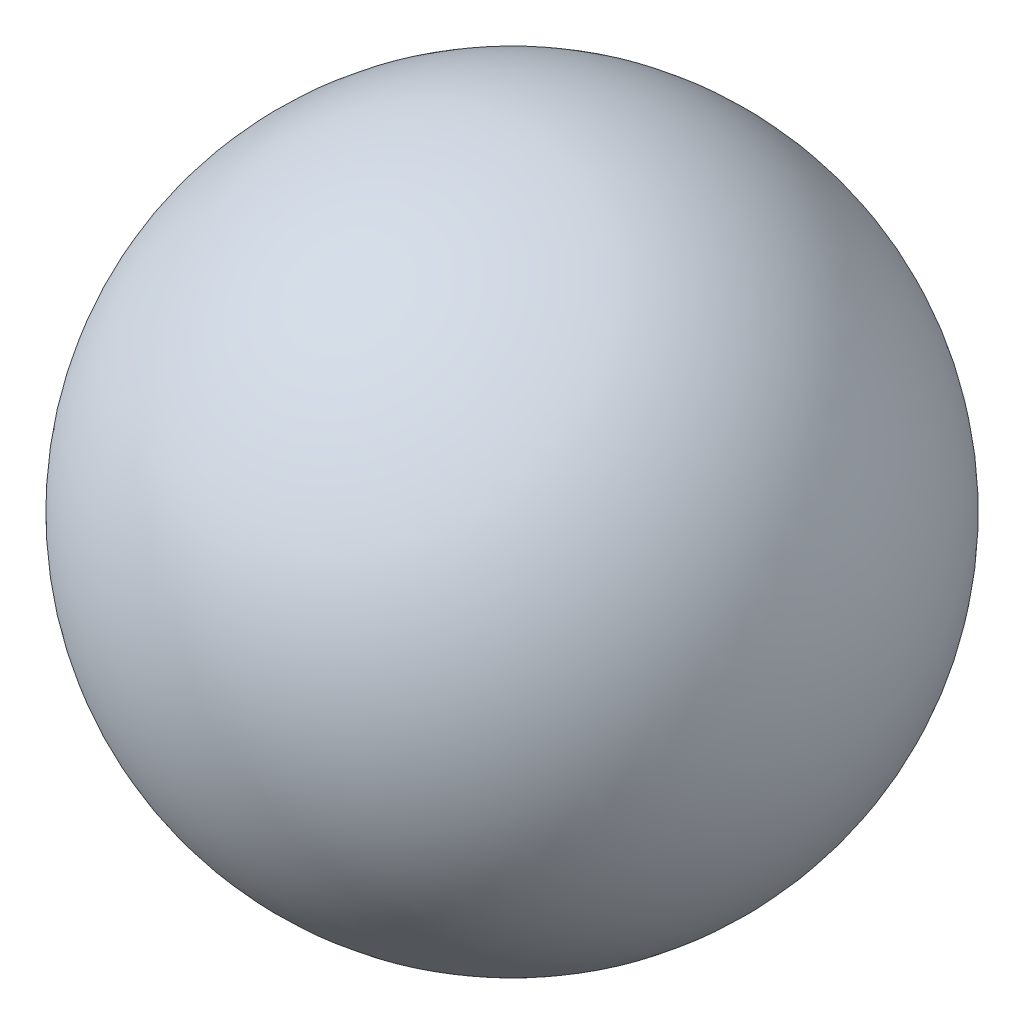
ISO-10303-21;
HEADER;
FILE_DESCRIPTION(('STEP AP214'),'2;1');
FILE_NAME('part.step','',(''),(''),'','','');
FILE_SCHEMA(('AUTOMOTIVE_DESIGN { 1 0 10303 214 1 1 1 1 }'));
ENDSEC;
DATA;
#1=APPLICATION_CONTEXT('core data for automotive mechanical design processes');
#2=APPLICATION_PROTOCOL_DEFINITION('international standard','automotive_design',2000,#1);
#3=PRODUCT_CONTEXT('',#1,'mechanical');
#4=PRODUCT('Part','Part','',(#3));
#5=PRODUCT_RELATED_PRODUCT_CATEGORY('part','',(#4));
#6=PRODUCT_DEFINITION_FORMATION('','',#4);
#7=PRODUCT_DEFINITION_CONTEXT('part definition',#1,'design');
#8=PRODUCT_DEFINITION('design','',#6,#7);
#9=PRODUCT_DEFINITION_SHAPE('','',#8);
#10=(LENGTH_UNIT() NAMED_UNIT(*) SI_UNIT(.MILLI.,.METRE.));
#11=(NAMED_UNIT(*) PLANE_ANGLE_UNIT() SI_UNIT($,.RADIAN.));
#12=(NAMED_UNIT(*) SI_UNIT($,.STERADIAN.) SOLID_ANGLE_UNIT());
#13=UNCERTAINTY_MEASURE_WITH_UNIT(LENGTH_MEASURE(1.E-05),#10,'distance_accuracy_value','');
#14=(GEOMETRIC_REPRESENTATION_CONTEXT(3) GLOBAL_UNCERTAINTY_ASSIGNED_CONTEXT((#13)) GLOBAL_UNIT_ASSIGNED_CONTEXT((#10,
#11,#12)) REPRESENTATION_CONTEXT('',''));
#15=CARTESIAN_POINT('',(0.,0.,0.));
#16=DIRECTION('',(0.,0.,1.));
#17=DIRECTION('',(1.,0.,0.));
#18=AXIS2_PLACEMENT_3D('',#15,#16,#17);
#19=CARTESIAN_POINT('',(0.,0.,0.));
#20=DIRECTION('',(0.,1.,0.));
#21=DIRECTION('',(1.,0.,0.));
#22=AXIS2_PLACEMENT_3D('',#19,#20,#21);
#23=SPHERICAL_SURFACE('',#22,80.);
#24=CARTESIAN_POINT('',(0.,80.,0.));
#25=VERTEX_POINT('',#24);
#26=VERTEX_LOOP('',#25);
#27=FACE_BOUND('',#26,.T.);
#28=ADVANCED_FACE('F34',(#27),#23,.T.);
#29=CLOSED_SHELL('',(#28));
#30=CARTESIAN_POINT('',(0.,0.,0.));
#31=DIRECTION('',(0.,1.,0.));
#32=DIRECTION('',(-1.,0.,0.));
#33=AXIS2_PLACEMENT_3D('',#30,#31,#32);
#34=SPHERICAL_SURFACE('',#33,76.);
#35=CARTESIAN_POINT('',(0.,76.,0.));
#36=VERTEX_POINT('',#35);
#37=VERTEX_LOOP('',#36);
#38=FACE_BOUND('',#37,.T.);
#39=ADVANCED_FACE('F47',(#38),#34,.F.);
#40=CLOSED_SHELL('',(#39));
#41=ORIENTED_CLOSED_SHELL('',*,#40,.T.);
#42=BREP_WITH_VOIDS('B2',#29,(#41));
#43=ADVANCED_BREP_SHAPE_REPRESENTATION('',(#18,#42),#14);
#44=SHAPE_DEFINITION_REPRESENTATION(#9,#43);
ENDSEC;
END-ISO-10303-21;
